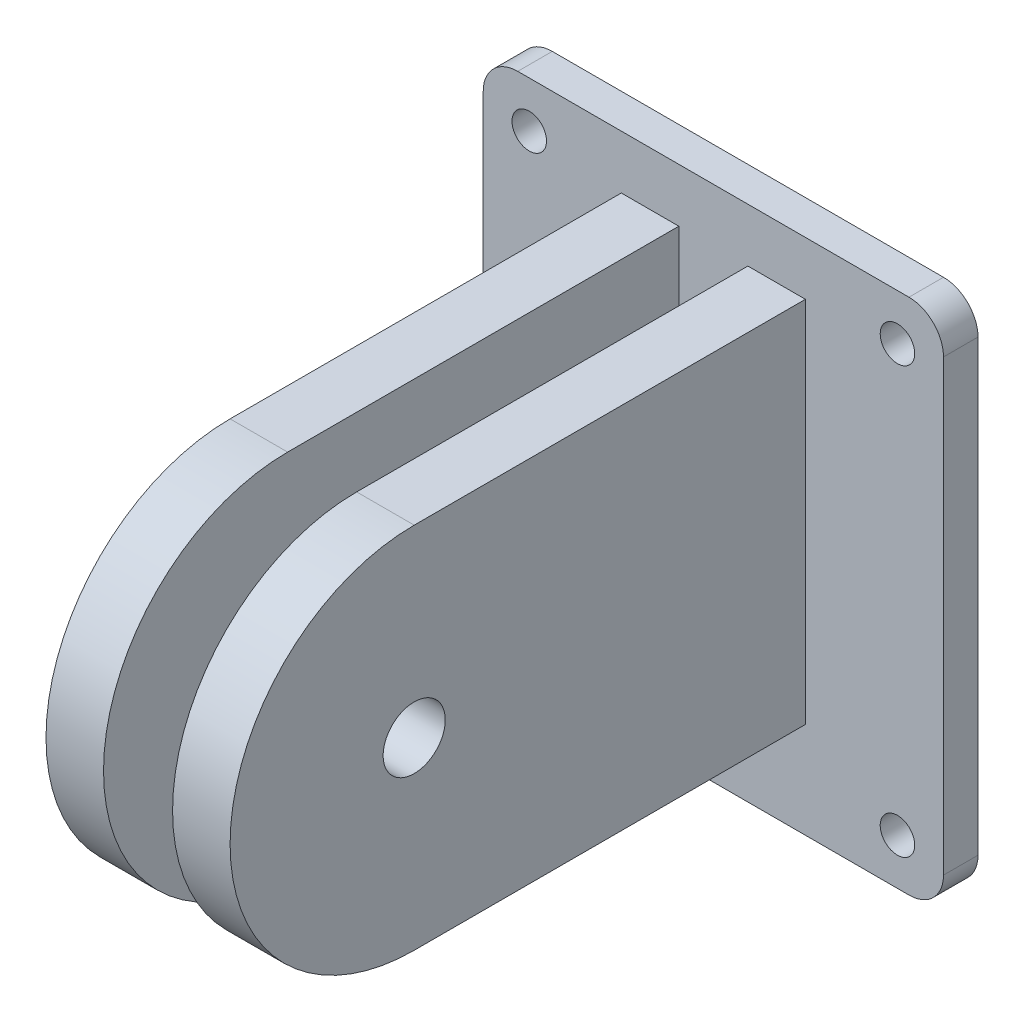
ISO-10303-21;
HEADER;
FILE_DESCRIPTION(('STEP AP214'),'2;1');
FILE_NAME('part.step','',(''),(''),'','','');
FILE_SCHEMA(('AUTOMOTIVE_DESIGN { 1 0 10303 214 1 1 1 1 }'));
ENDSEC;
DATA;
#1=APPLICATION_CONTEXT('core data for automotive mechanical design processes');
#2=APPLICATION_PROTOCOL_DEFINITION('international standard','automotive_design',2000,#1);
#3=PRODUCT_CONTEXT('',#1,'mechanical');
#4=PRODUCT('Part','Part','',(#3));
#5=PRODUCT_RELATED_PRODUCT_CATEGORY('part','',(#4));
#6=PRODUCT_DEFINITION_FORMATION('','',#4);
#7=PRODUCT_DEFINITION_CONTEXT('part definition',#1,'design');
#8=PRODUCT_DEFINITION('design','',#6,#7);
#9=PRODUCT_DEFINITION_SHAPE('','',#8);
#10=(LENGTH_UNIT() NAMED_UNIT(*) SI_UNIT(.MILLI.,.METRE.));
#11=(NAMED_UNIT(*) PLANE_ANGLE_UNIT() SI_UNIT($,.RADIAN.));
#12=(NAMED_UNIT(*) SI_UNIT($,.STERADIAN.) SOLID_ANGLE_UNIT());
#13=UNCERTAINTY_MEASURE_WITH_UNIT(LENGTH_MEASURE(1.E-05),#10,'distance_accuracy_value','');
#14=(GEOMETRIC_REPRESENTATION_CONTEXT(3) GLOBAL_UNCERTAINTY_ASSIGNED_CONTEXT((#13)) GLOBAL_UNIT_ASSIGNED_CONTEXT((#10,
#11,#12)) REPRESENTATION_CONTEXT('',''));
#15=CARTESIAN_POINT('',(0.,0.,0.));
#16=DIRECTION('',(0.,0.,1.));
#17=DIRECTION('',(1.,0.,0.));
#18=AXIS2_PLACEMENT_3D('',#15,#16,#17);
#19=CARTESIAN_POINT('',(2.99999999999999,442.,53.));
#20=DIRECTION('',(0.,-1.,0.));
#21=DIRECTION('',(0.,0.,-1.));
#22=AXIS2_PLACEMENT_3D('',#19,#20,#21);
#23=PLANE('',#22);
#24=DIRECTION('',(1.,0.,0.));
#25=VECTOR('',#24,1.);
#26=CARTESIAN_POINT('',(-20.,442.,37.));
#27=LINE('',#26,#25);
#28=CARTESIAN_POINT('',(2.99999999999998,442.,37.));
#29=VERTEX_POINT('',#28);
#30=CARTESIAN_POINT('',(7.99999999999999,442.,37.));
#31=VERTEX_POINT('',#30);
#32=EDGE_CURVE('E166',#29,#31,#27,.T.);
#33=ORIENTED_EDGE('',*,*,#32,.T.);
#34=DIRECTION('',(0.,0.,-1.));
#35=VECTOR('',#34,1.);
#36=CARTESIAN_POINT('',(7.99999999999999,442.,53.));
#37=LINE('',#36,#35);
#38=CARTESIAN_POINT('',(7.99999999999999,442.,3.));
#39=VERTEX_POINT('',#38);
#40=EDGE_CURVE('E165',#31,#39,#37,.T.);
#41=ORIENTED_EDGE('',*,*,#40,.T.);
#42=DIRECTION('',(-1.,0.,0.));
#43=VECTOR('',#42,1.);
#44=CARTESIAN_POINT('',(2.99999999999999,442.,3.));
#45=LINE('',#44,#43);
#46=CARTESIAN_POINT('',(2.99999999999999,442.,3.));
#47=VERTEX_POINT('',#46);
#48=EDGE_CURVE('E371',#39,#47,#45,.T.);
#49=ORIENTED_EDGE('',*,*,#48,.T.);
#50=DIRECTION('',(0.,0.,-1.));
#51=VECTOR('',#50,1.);
#52=CARTESIAN_POINT('',(2.99999999999999,442.,53.));
#53=LINE('',#52,#51);
#54=EDGE_CURVE('E177',#29,#47,#53,.T.);
#55=ORIENTED_EDGE('',*,*,#54,.F.);
#56=EDGE_LOOP('',(#33,#41,#49,#55));
#57=FACE_BOUND('',#56,.T.);
#58=ADVANCED_FACE('F32',(#57),#23,.F.);
#59=CARTESIAN_POINT('',(-3.00000000000001,442.,53.));
#60=DIRECTION('',(0.,-1.,0.));
#61=DIRECTION('',(0.,0.,-1.));
#62=AXIS2_PLACEMENT_3D('',#59,#60,#61);
#63=PLANE('',#62);
#64=CARTESIAN_POINT('',(-8.00000000000001,442.,37.));
#65=VERTEX_POINT('',#64);
#66=CARTESIAN_POINT('',(-3.00000000000002,442.,37.));
#67=VERTEX_POINT('',#66);
#68=EDGE_CURVE('E157',#65,#67,#27,.T.);
#69=ORIENTED_EDGE('',*,*,#68,.T.);
#70=DIRECTION('',(0.,0.,-1.));
#71=VECTOR('',#70,1.);
#72=CARTESIAN_POINT('',(-3.00000000000001,442.,53.));
#73=LINE('',#72,#71);
#74=CARTESIAN_POINT('',(-3.00000000000001,442.,3.));
#75=VERTEX_POINT('',#74);
#76=EDGE_CURVE('E363',#67,#75,#73,.T.);
#77=ORIENTED_EDGE('',*,*,#76,.T.);
#78=DIRECTION('',(-1.,0.,0.));
#79=VECTOR('',#78,1.);
#80=CARTESIAN_POINT('',(-3.00000000000001,442.,3.));
#81=LINE('',#80,#79);
#82=CARTESIAN_POINT('',(-8.,442.,3.));
#83=VERTEX_POINT('',#82);
#84=EDGE_CURVE('E348',#75,#83,#81,.T.);
#85=ORIENTED_EDGE('',*,*,#84,.T.);
#86=DIRECTION('',(0.,0.,-1.));
#87=VECTOR('',#86,1.);
#88=CARTESIAN_POINT('',(-8.,442.,53.));
#89=LINE('',#88,#87);
#90=EDGE_CURVE('E361',#65,#83,#89,.T.);
#91=ORIENTED_EDGE('',*,*,#90,.F.);
#92=EDGE_LOOP('',(#69,#77,#85,#91));
#93=FACE_BOUND('',#92,.T.);
#94=ADVANCED_FACE('F276',(#93),#63,.F.);
#95=CARTESIAN_POINT('',(0.,0.,3.));
#96=DIRECTION('',(0.,0.,-1.));
#97=DIRECTION('',(-1.,0.,0.));
#98=AXIS2_PLACEMENT_3D('',#95,#96,#97);
#99=PLANE('',#98);
#100=CARTESIAN_POINT('',(16.,442.657979856674,3.));
#101=DIRECTION('',(0.,0.,1.));
#102=DIRECTION('',(-1.,0.,0.));
#103=AXIS2_PLACEMENT_3D('',#100,#101,#102);
#104=CIRCLE('',#103,1.5);
#105=CARTESIAN_POINT('',(14.5,442.657979856674,3.));
#106=VERTEX_POINT('',#105);
#107=EDGE_CURVE('E541',#106,#106,#104,.T.);
#108=ORIENTED_EDGE('',*,*,#107,.F.);
#109=EDGE_LOOP('',(#108));
#110=FACE_BOUND('',#109,.T.);
#111=CARTESIAN_POINT('',(16.,405.657979856674,3.));
#112=DIRECTION('',(0.,0.,1.));
#113=DIRECTION('',(1.,0.,0.));
#114=AXIS2_PLACEMENT_3D('',#111,#112,#113);
#115=CIRCLE('',#114,1.5);
#116=CARTESIAN_POINT('',(17.5,405.657979856674,3.));
#117=VERTEX_POINT('',#116);
#118=EDGE_CURVE('E543',#117,#117,#115,.T.);
#119=ORIENTED_EDGE('',*,*,#118,.F.);
#120=EDGE_LOOP('',(#119));
#121=FACE_BOUND('',#120,.T.);
#122=CARTESIAN_POINT('',(-16.,405.657979856674,3.));
#123=DIRECTION('',(0.,0.,1.));
#124=DIRECTION('',(-1.,0.,0.));
#125=AXIS2_PLACEMENT_3D('',#122,#123,#124);
#126=CIRCLE('',#125,1.5);
#127=CARTESIAN_POINT('',(-17.5,405.657979856674,3.));
#128=VERTEX_POINT('',#127);
#129=EDGE_CURVE('E555',#128,#128,#126,.T.);
#130=ORIENTED_EDGE('',*,*,#129,.F.);
#131=EDGE_LOOP('',(#130));
#132=FACE_BOUND('',#131,.T.);
#133=CARTESIAN_POINT('',(-16.,442.657979856674,3.));
#134=DIRECTION('',(0.,0.,1.));
#135=DIRECTION('',(1.,0.,0.));
#136=AXIS2_PLACEMENT_3D('',#133,#134,#135);
#137=CIRCLE('',#136,1.5);
#138=CARTESIAN_POINT('',(-14.5,442.657979856674,3.));
#139=VERTEX_POINT('',#138);
#140=EDGE_CURVE('E549',#139,#139,#137,.T.);
#141=ORIENTED_EDGE('',*,*,#140,.F.);
#142=EDGE_LOOP('',(#141));
#143=FACE_BOUND('',#142,.T.);
#144=DIRECTION('',(0.,-1.,0.));
#145=VECTOR('',#144,1.);
#146=CARTESIAN_POINT('',(2.99999999999999,442.,3.));
#147=LINE('',#146,#145);
#148=CARTESIAN_POINT('',(3.,410.,3.));
#149=VERTEX_POINT('',#148);
#150=EDGE_CURVE('E365',#47,#149,#147,.T.);
#151=ORIENTED_EDGE('',*,*,#150,.F.);
#152=ORIENTED_EDGE('',*,*,#48,.F.);
#153=DIRECTION('',(0.,1.,0.));
#154=VECTOR('',#153,1.);
#155=CARTESIAN_POINT('',(7.99999999999999,442.,3.));
#156=LINE('',#155,#154);
#157=CARTESIAN_POINT('',(8.,410.,3.));
#158=VERTEX_POINT('',#157);
#159=EDGE_CURVE('E369',#158,#39,#156,.T.);
#160=ORIENTED_EDGE('',*,*,#159,.F.);
#161=DIRECTION('',(1.,0.,0.));
#162=VECTOR('',#161,1.);
#163=CARTESIAN_POINT('',(3.,410.,3.));
#164=LINE('',#163,#162);
#165=EDGE_CURVE('E172',#149,#158,#164,.T.);
#166=ORIENTED_EDGE('',*,*,#165,.F.);
#167=EDGE_LOOP('',(#151,#152,#160,#166));
#168=FACE_BOUND('',#167,.T.);
#169=DIRECTION('',(0.,-1.,0.));
#170=VECTOR('',#169,1.);
#171=CARTESIAN_POINT('',(-20.,401.657979856674,3.));
#172=LINE('',#171,#170);
#173=CARTESIAN_POINT('',(-20.,443.657979856674,3.));
#174=VERTEX_POINT('',#173);
#175=CARTESIAN_POINT('',(-20.,404.657979856674,3.));
#176=VERTEX_POINT('',#175);
#177=EDGE_CURVE('E181',#174,#176,#172,.T.);
#178=ORIENTED_EDGE('',*,*,#177,.T.);
#179=CARTESIAN_POINT('',(-17.,404.657979856674,3.));
#180=DIRECTION('',(0.,0.,-1.));
#181=DIRECTION('',(-1.,0.,0.));
#182=AXIS2_PLACEMENT_3D('',#179,#180,#181);
#183=CIRCLE('',#182,3.);
#184=CARTESIAN_POINT('',(-17.,401.657979856674,3.));
#185=VERTEX_POINT('',#184);
#186=EDGE_CURVE('E228',#176,#185,#183,.F.);
#187=ORIENTED_EDGE('',*,*,#186,.T.);
#188=DIRECTION('',(1.,0.,0.));
#189=VECTOR('',#188,1.);
#190=CARTESIAN_POINT('',(-20.,401.657979856674,3.));
#191=LINE('',#190,#189);
#192=CARTESIAN_POINT('',(17.,401.657979856674,3.));
#193=VERTEX_POINT('',#192);
#194=EDGE_CURVE('E184',#185,#193,#191,.T.);
#195=ORIENTED_EDGE('',*,*,#194,.T.);
#196=CARTESIAN_POINT('',(17.,404.657979856674,3.));
#197=DIRECTION('',(0.,0.,-1.));
#198=DIRECTION('',(-1.,0.,0.));
#199=AXIS2_PLACEMENT_3D('',#196,#197,#198);
#200=CIRCLE('',#199,3.);
#201=CARTESIAN_POINT('',(20.,404.657979856674,3.));
#202=VERTEX_POINT('',#201);
#203=EDGE_CURVE('E224',#193,#202,#200,.F.);
#204=ORIENTED_EDGE('',*,*,#203,.T.);
#205=DIRECTION('',(0.,1.,0.));
#206=VECTOR('',#205,1.);
#207=CARTESIAN_POINT('',(20.,401.657979856674,3.));
#208=LINE('',#207,#206);
#209=CARTESIAN_POINT('',(20.,443.657979856674,3.));
#210=VERTEX_POINT('',#209);
#211=EDGE_CURVE('E188',#202,#210,#208,.T.);
#212=ORIENTED_EDGE('',*,*,#211,.T.);
#213=CARTESIAN_POINT('',(17.,443.657979856674,3.));
#214=DIRECTION('',(0.,0.,-1.));
#215=DIRECTION('',(-1.,0.,0.));
#216=AXIS2_PLACEMENT_3D('',#213,#214,#215);
#217=CIRCLE('',#216,3.);
#218=CARTESIAN_POINT('',(17.,446.657979856674,3.));
#219=VERTEX_POINT('',#218);
#220=EDGE_CURVE('E54',#210,#219,#217,.F.);
#221=ORIENTED_EDGE('',*,*,#220,.T.);
#222=DIRECTION('',(-1.,0.,0.));
#223=VECTOR('',#222,1.);
#224=CARTESIAN_POINT('',(-20.,446.657979856674,3.));
#225=LINE('',#224,#223);
#226=CARTESIAN_POINT('',(-17.,446.657979856674,3.));
#227=VERTEX_POINT('',#226);
#228=EDGE_CURVE('E190',#219,#227,#225,.T.);
#229=ORIENTED_EDGE('',*,*,#228,.T.);
#230=CARTESIAN_POINT('',(-17.,443.657979856674,3.));
#231=DIRECTION('',(0.,0.,-1.));
#232=DIRECTION('',(-1.,0.,0.));
#233=AXIS2_PLACEMENT_3D('',#230,#231,#232);
#234=CIRCLE('',#233,3.);
#235=EDGE_CURVE('E226',#227,#174,#234,.F.);
#236=ORIENTED_EDGE('',*,*,#235,.T.);
#237=EDGE_LOOP('',(#178,#187,#195,#204,#212,#221,#229,#236));
#238=FACE_BOUND('',#237,.T.);
#239=DIRECTION('',(0.,1.,0.));
#240=VECTOR('',#239,1.);
#241=CARTESIAN_POINT('',(-3.00000000000001,442.,3.));
#242=LINE('',#241,#240);
#243=CARTESIAN_POINT('',(-3.,410.,3.));
#244=VERTEX_POINT('',#243);
#245=EDGE_CURVE('E341',#244,#75,#242,.T.);
#246=ORIENTED_EDGE('',*,*,#245,.F.);
#247=DIRECTION('',(1.,0.,0.));
#248=VECTOR('',#247,1.);
#249=CARTESIAN_POINT('',(-3.,410.,3.));
#250=LINE('',#249,#248);
#251=CARTESIAN_POINT('',(-8.,410.,3.));
#252=VERTEX_POINT('',#251);
#253=EDGE_CURVE('E354',#252,#244,#250,.T.);
#254=ORIENTED_EDGE('',*,*,#253,.F.);
#255=DIRECTION('',(0.,-1.,0.));
#256=VECTOR('',#255,1.);
#257=CARTESIAN_POINT('',(-8.,442.,3.));
#258=LINE('',#257,#256);
#259=EDGE_CURVE('E351',#83,#252,#258,.T.);
#260=ORIENTED_EDGE('',*,*,#259,.F.);
#261=ORIENTED_EDGE('',*,*,#84,.F.);
#262=EDGE_LOOP('',(#246,#254,#260,#261));
#263=FACE_BOUND('',#262,.T.);
#264=ADVANCED_FACE('F240',(#110,#121,#132,#143,#168,#238,#263),#99,.F.);
#265=CARTESIAN_POINT('',(-20.,401.657979856674,3.));
#266=DIRECTION('',(1.,0.,0.));
#267=DIRECTION('',(0.,0.,-1.));
#268=AXIS2_PLACEMENT_3D('',#265,#266,#267);
#269=PLANE('',#268);
#270=DIRECTION('',(0.,-1.,0.));
#271=VECTOR('',#270,1.);
#272=CARTESIAN_POINT('',(-20.,401.657979856674,0.));
#273=LINE('',#272,#271);
#274=CARTESIAN_POINT('',(-20.,443.657979856674,0.));
#275=VERTEX_POINT('',#274);
#276=CARTESIAN_POINT('',(-20.,404.657979856674,0.));
#277=VERTEX_POINT('',#276);
#278=EDGE_CURVE('E175',#275,#277,#273,.T.);
#279=ORIENTED_EDGE('',*,*,#278,.T.);
#280=DIRECTION('',(0.,0.,-1.));
#281=VECTOR('',#280,1.);
#282=CARTESIAN_POINT('',(-20.,404.657979856674,3.));
#283=LINE('',#282,#281);
#284=EDGE_CURVE('E221',#277,#176,#283,.F.);
#285=ORIENTED_EDGE('',*,*,#284,.T.);
#286=ORIENTED_EDGE('',*,*,#177,.F.);
#287=DIRECTION('',(0.,0.,-1.));
#288=VECTOR('',#287,1.);
#289=CARTESIAN_POINT('',(-20.,443.657979856674,3.));
#290=LINE('',#289,#288);
#291=EDGE_CURVE('E218',#174,#275,#290,.T.);
#292=ORIENTED_EDGE('',*,*,#291,.T.);
#293=EDGE_LOOP('',(#279,#285,#286,#292));
#294=FACE_BOUND('',#293,.T.);
#295=ADVANCED_FACE('F256',(#294),#269,.F.);
#296=CARTESIAN_POINT('',(-20.,401.657979856674,3.));
#297=DIRECTION('',(0.,1.,0.));
#298=DIRECTION('',(0.,0.,1.));
#299=AXIS2_PLACEMENT_3D('',#296,#297,#298);
#300=PLANE('',#299);
#301=ORIENTED_EDGE('',*,*,#194,.F.);
#302=DIRECTION('',(0.,0.,-1.));
#303=VECTOR('',#302,1.);
#304=CARTESIAN_POINT('',(-17.,401.657979856674,3.));
#305=LINE('',#304,#303);
#306=CARTESIAN_POINT('',(-17.,401.657979856674,0.));
#307=VERTEX_POINT('',#306);
#308=EDGE_CURVE('E207',#185,#307,#305,.T.);
#309=ORIENTED_EDGE('',*,*,#308,.T.);
#310=DIRECTION('',(1.,0.,0.));
#311=VECTOR('',#310,1.);
#312=CARTESIAN_POINT('',(-20.,401.657979856674,0.));
#313=LINE('',#312,#311);
#314=CARTESIAN_POINT('',(17.,401.657979856674,0.));
#315=VERTEX_POINT('',#314);
#316=EDGE_CURVE('E195',#307,#315,#313,.T.);
#317=ORIENTED_EDGE('',*,*,#316,.T.);
#318=DIRECTION('',(0.,0.,-1.));
#319=VECTOR('',#318,1.);
#320=CARTESIAN_POINT('',(17.,401.657979856674,3.));
#321=LINE('',#320,#319);
#322=EDGE_CURVE('E192',#315,#193,#321,.F.);
#323=ORIENTED_EDGE('',*,*,#322,.T.);
#324=EDGE_LOOP('',(#301,#309,#317,#323));
#325=FACE_BOUND('',#324,.T.);
#326=ADVANCED_FACE('F264',(#325),#300,.F.);
#327=CARTESIAN_POINT('',(20.,401.657979856674,3.));
#328=DIRECTION('',(-1.,0.,0.));
#329=DIRECTION('',(0.,0.,1.));
#330=AXIS2_PLACEMENT_3D('',#327,#328,#329);
#331=PLANE('',#330);
#332=ORIENTED_EDGE('',*,*,#211,.F.);
#333=DIRECTION('',(0.,0.,-1.));
#334=VECTOR('',#333,1.);
#335=CARTESIAN_POINT('',(20.,404.657979856674,3.));
#336=LINE('',#335,#334);
#337=CARTESIAN_POINT('',(20.,404.657979856674,0.));
#338=VERTEX_POINT('',#337);
#339=EDGE_CURVE('E11',#202,#338,#336,.T.);
#340=ORIENTED_EDGE('',*,*,#339,.T.);
#341=DIRECTION('',(0.,1.,0.));
#342=VECTOR('',#341,1.);
#343=CARTESIAN_POINT('',(20.,401.657979856674,0.));
#344=LINE('',#343,#342);
#345=CARTESIAN_POINT('',(20.,443.657979856674,0.));
#346=VERTEX_POINT('',#345);
#347=EDGE_CURVE('E198',#338,#346,#344,.T.);
#348=ORIENTED_EDGE('',*,*,#347,.T.);
#349=DIRECTION('',(0.,0.,-1.));
#350=VECTOR('',#349,1.);
#351=CARTESIAN_POINT('',(20.,443.657979856674,3.));
#352=LINE('',#351,#350);
#353=EDGE_CURVE('E40',#346,#210,#352,.F.);
#354=ORIENTED_EDGE('',*,*,#353,.T.);
#355=EDGE_LOOP('',(#332,#340,#348,#354));
#356=FACE_BOUND('',#355,.T.);
#357=ADVANCED_FACE('F236',(#356),#331,.F.);
#358=CARTESIAN_POINT('',(-20.,446.657979856674,3.));
#359=DIRECTION('',(0.,-1.,0.));
#360=DIRECTION('',(0.,0.,-1.));
#361=AXIS2_PLACEMENT_3D('',#358,#359,#360);
#362=PLANE('',#361);
#363=DIRECTION('',(-1.,0.,0.));
#364=VECTOR('',#363,1.);
#365=CARTESIAN_POINT('',(-20.,446.657979856674,0.));
#366=LINE('',#365,#364);
#367=CARTESIAN_POINT('',(17.,446.657979856674,0.));
#368=VERTEX_POINT('',#367);
#369=CARTESIAN_POINT('',(-17.,446.657979856674,0.));
#370=VERTEX_POINT('',#369);
#371=EDGE_CURVE('E185',#368,#370,#366,.T.);
#372=ORIENTED_EDGE('',*,*,#371,.T.);
#373=DIRECTION('',(0.,0.,-1.));
#374=VECTOR('',#373,1.);
#375=CARTESIAN_POINT('',(-17.,446.657979856674,3.));
#376=LINE('',#375,#374);
#377=EDGE_CURVE('E47',#370,#227,#376,.F.);
#378=ORIENTED_EDGE('',*,*,#377,.T.);
#379=ORIENTED_EDGE('',*,*,#228,.F.);
#380=DIRECTION('',(0.,0.,-1.));
#381=VECTOR('',#380,1.);
#382=CARTESIAN_POINT('',(17.,446.657979856674,3.));
#383=LINE('',#382,#381);
#384=EDGE_CURVE('E230',#219,#368,#383,.T.);
#385=ORIENTED_EDGE('',*,*,#384,.T.);
#386=EDGE_LOOP('',(#372,#378,#379,#385));
#387=FACE_BOUND('',#386,.T.);
#388=ADVANCED_FACE('F245',(#387),#362,.F.);
#389=CARTESIAN_POINT('',(0.,0.,0.));
#390=DIRECTION('',(0.,0.,-1.));
#391=DIRECTION('',(-1.,0.,0.));
#392=AXIS2_PLACEMENT_3D('',#389,#390,#391);
#393=PLANE('',#392);
#394=CARTESIAN_POINT('',(16.,442.657979856674,0.));
#395=DIRECTION('',(0.,0.,1.));
#396=DIRECTION('',(-1.,0.,0.));
#397=AXIS2_PLACEMENT_3D('',#394,#395,#396);
#398=CIRCLE('',#397,1.5);
#399=CARTESIAN_POINT('',(14.5,442.657979856674,0.));
#400=VERTEX_POINT('',#399);
#401=EDGE_CURVE('E538',#400,#400,#398,.T.);
#402=ORIENTED_EDGE('',*,*,#401,.T.);
#403=EDGE_LOOP('',(#402));
#404=FACE_BOUND('',#403,.T.);
#405=CARTESIAN_POINT('',(16.,405.657979856674,0.));
#406=DIRECTION('',(0.,0.,1.));
#407=DIRECTION('',(1.,0.,0.));
#408=AXIS2_PLACEMENT_3D('',#405,#406,#407);
#409=CIRCLE('',#408,1.5);
#410=CARTESIAN_POINT('',(17.5,405.657979856674,0.));
#411=VERTEX_POINT('',#410);
#412=EDGE_CURVE('E560',#411,#411,#409,.T.);
#413=ORIENTED_EDGE('',*,*,#412,.T.);
#414=EDGE_LOOP('',(#413));
#415=FACE_BOUND('',#414,.T.);
#416=CARTESIAN_POINT('',(-16.,405.657979856674,0.));
#417=DIRECTION('',(0.,0.,1.));
#418=DIRECTION('',(-1.,0.,0.));
#419=AXIS2_PLACEMENT_3D('',#416,#417,#418);
#420=CIRCLE('',#419,1.5);
#421=CARTESIAN_POINT('',(-17.5,405.657979856674,0.));
#422=VERTEX_POINT('',#421);
#423=EDGE_CURVE('E551',#422,#422,#420,.T.);
#424=ORIENTED_EDGE('',*,*,#423,.T.);
#425=EDGE_LOOP('',(#424));
#426=FACE_BOUND('',#425,.T.);
#427=CARTESIAN_POINT('',(-16.,442.657979856674,0.));
#428=DIRECTION('',(0.,0.,1.));
#429=DIRECTION('',(1.,0.,0.));
#430=AXIS2_PLACEMENT_3D('',#427,#428,#429);
#431=CIRCLE('',#430,1.5);
#432=CARTESIAN_POINT('',(-14.5,442.657979856674,0.));
#433=VERTEX_POINT('',#432);
#434=EDGE_CURVE('E167',#433,#433,#431,.T.);
#435=ORIENTED_EDGE('',*,*,#434,.T.);
#436=EDGE_LOOP('',(#435));
#437=FACE_BOUND('',#436,.T.);
#438=ORIENTED_EDGE('',*,*,#316,.F.);
#439=CARTESIAN_POINT('',(-17.,404.657979856674,0.));
#440=DIRECTION('',(0.,0.,-1.));
#441=DIRECTION('',(-1.,0.,0.));
#442=AXIS2_PLACEMENT_3D('',#439,#440,#441);
#443=CIRCLE('',#442,3.);
#444=EDGE_CURVE('E216',#307,#277,#443,.T.);
#445=ORIENTED_EDGE('',*,*,#444,.T.);
#446=ORIENTED_EDGE('',*,*,#278,.F.);
#447=CARTESIAN_POINT('',(-17.,443.657979856674,0.));
#448=DIRECTION('',(0.,0.,-1.));
#449=DIRECTION('',(-1.,0.,0.));
#450=AXIS2_PLACEMENT_3D('',#447,#448,#449);
#451=CIRCLE('',#450,3.);
#452=EDGE_CURVE('E214',#275,#370,#451,.T.);
#453=ORIENTED_EDGE('',*,*,#452,.T.);
#454=ORIENTED_EDGE('',*,*,#371,.F.);
#455=CARTESIAN_POINT('',(17.,443.657979856674,0.));
#456=DIRECTION('',(0.,0.,-1.));
#457=DIRECTION('',(-1.,0.,0.));
#458=AXIS2_PLACEMENT_3D('',#455,#456,#457);
#459=CIRCLE('',#458,3.);
#460=EDGE_CURVE('E210',#368,#346,#459,.T.);
#461=ORIENTED_EDGE('',*,*,#460,.T.);
#462=ORIENTED_EDGE('',*,*,#347,.F.);
#463=CARTESIAN_POINT('',(17.,404.657979856674,0.));
#464=DIRECTION('',(0.,0.,-1.));
#465=DIRECTION('',(-1.,0.,0.));
#466=AXIS2_PLACEMENT_3D('',#463,#464,#465);
#467=CIRCLE('',#466,3.);
#468=EDGE_CURVE('E212',#338,#315,#467,.T.);
#469=ORIENTED_EDGE('',*,*,#468,.T.);
#470=EDGE_LOOP('',(#438,#445,#446,#453,#454,#461,#462,#469));
#471=FACE_BOUND('',#470,.T.);
#472=ADVANCED_FACE('F248',(#404,#415,#426,#437,#471),#393,.T.);
#473=CARTESIAN_POINT('',(2.99999999999999,442.,53.));
#474=DIRECTION('',(1.,0.,0.));
#475=DIRECTION('',(0.,1.,0.));
#476=AXIS2_PLACEMENT_3D('',#473,#474,#475);
#477=PLANE('',#476);
#478=CARTESIAN_POINT('',(3.,426.,37.));
#479=DIRECTION('',(1.,0.,0.));
#480=DIRECTION('',(0.,1.,0.));
#481=AXIS2_PLACEMENT_3D('',#478,#479,#480);
#482=CIRCLE('',#481,2.70000000000007);
#483=CARTESIAN_POINT('',(2.99999999999999,428.7,37.));
#484=VERTEX_POINT('',#483);
#485=EDGE_CURVE('E338',#484,#484,#482,.T.);
#486=ORIENTED_EDGE('',*,*,#485,.T.);
#487=EDGE_LOOP('',(#486));
#488=FACE_BOUND('',#487,.T.);
#489=DIRECTION('',(0.,0.,-1.));
#490=VECTOR('',#489,1.);
#491=CARTESIAN_POINT('',(3.,410.,53.));
#492=LINE('',#491,#490);
#493=CARTESIAN_POINT('',(2.99999999999998,410.,37.));
#494=VERTEX_POINT('',#493);
#495=EDGE_CURVE('E173',#494,#149,#492,.T.);
#496=ORIENTED_EDGE('',*,*,#495,.F.);
#497=CARTESIAN_POINT('',(3.,426.,37.));
#498=DIRECTION('',(1.,0.,0.));
#499=DIRECTION('',(0.,1.,0.));
#500=AXIS2_PLACEMENT_3D('',#497,#498,#499);
#501=CIRCLE('',#500,16.);
#502=EDGE_CURVE('E152',#494,#29,#501,.F.);
#503=ORIENTED_EDGE('',*,*,#502,.T.);
#504=ORIENTED_EDGE('',*,*,#54,.T.);
#505=ORIENTED_EDGE('',*,*,#150,.T.);
#506=EDGE_LOOP('',(#496,#503,#504,#505));
#507=FACE_BOUND('',#506,.T.);
#508=ADVANCED_FACE('F292',(#488,#507),#477,.F.);
#509=CARTESIAN_POINT('',(3.,410.,53.));
#510=DIRECTION('',(0.,1.,0.));
#511=DIRECTION('',(0.,0.,1.));
#512=AXIS2_PLACEMENT_3D('',#509,#510,#511);
#513=PLANE('',#512);
#514=DIRECTION('',(0.,0.,-1.));
#515=VECTOR('',#514,1.);
#516=CARTESIAN_POINT('',(8.,410.,53.));
#517=LINE('',#516,#515);
#518=CARTESIAN_POINT('',(7.99999999999999,410.,37.));
#519=VERTEX_POINT('',#518);
#520=EDGE_CURVE('E163',#519,#158,#517,.T.);
#521=ORIENTED_EDGE('',*,*,#520,.F.);
#522=DIRECTION('',(1.,0.,0.));
#523=VECTOR('',#522,1.);
#524=CARTESIAN_POINT('',(-20.,410.,37.));
#525=LINE('',#524,#523);
#526=EDGE_CURVE('E146',#494,#519,#525,.T.);
#527=ORIENTED_EDGE('',*,*,#526,.F.);
#528=ORIENTED_EDGE('',*,*,#495,.T.);
#529=ORIENTED_EDGE('',*,*,#165,.T.);
#530=EDGE_LOOP('',(#521,#527,#528,#529));
#531=FACE_BOUND('',#530,.T.);
#532=ADVANCED_FACE('F170',(#531),#513,.F.);
#533=CARTESIAN_POINT('',(7.99999999999999,442.,53.));
#534=DIRECTION('',(-1.,0.,0.));
#535=DIRECTION('',(0.,-1.,0.));
#536=AXIS2_PLACEMENT_3D('',#533,#534,#535);
#537=PLANE('',#536);
#538=CARTESIAN_POINT('',(7.99999999999999,426.,37.));
#539=DIRECTION('',(1.,0.,0.));
#540=DIRECTION('',(0.,1.,0.));
#541=AXIS2_PLACEMENT_3D('',#538,#539,#540);
#542=CIRCLE('',#541,2.70000000000007);
#543=CARTESIAN_POINT('',(7.99999999999999,428.7,37.));
#544=VERTEX_POINT('',#543);
#545=EDGE_CURVE('E381',#544,#544,#542,.T.);
#546=ORIENTED_EDGE('',*,*,#545,.F.);
#547=EDGE_LOOP('',(#546));
#548=FACE_BOUND('',#547,.T.);
#549=ORIENTED_EDGE('',*,*,#40,.F.);
#550=CARTESIAN_POINT('',(7.99999999999999,426.,37.));
#551=DIRECTION('',(-1.,0.,0.));
#552=DIRECTION('',(0.,1.,0.));
#553=AXIS2_PLACEMENT_3D('',#550,#551,#552);
#554=CIRCLE('',#553,16.);
#555=EDGE_CURVE('E150',#519,#31,#554,.T.);
#556=ORIENTED_EDGE('',*,*,#555,.F.);
#557=ORIENTED_EDGE('',*,*,#520,.T.);
#558=ORIENTED_EDGE('',*,*,#159,.T.);
#559=EDGE_LOOP('',(#549,#556,#557,#558));
#560=FACE_BOUND('',#559,.T.);
#561=ADVANCED_FACE('F161',(#548,#560),#537,.F.);
#562=CARTESIAN_POINT('',(-3.00000000000001,442.,53.));
#563=DIRECTION('',(-1.,0.,0.));
#564=DIRECTION('',(0.,-1.,0.));
#565=AXIS2_PLACEMENT_3D('',#562,#563,#564);
#566=PLANE('',#565);
#567=CARTESIAN_POINT('',(-3.,426.,37.));
#568=DIRECTION('',(-1.,0.,0.));
#569=DIRECTION('',(0.,-1.,0.));
#570=AXIS2_PLACEMENT_3D('',#567,#568,#569);
#571=CIRCLE('',#570,2.70000000000007);
#572=CARTESIAN_POINT('',(-3.00000000000001,428.7,37.));
#573=VERTEX_POINT('',#572);
#574=EDGE_CURVE('E205',#573,#573,#571,.T.);
#575=ORIENTED_EDGE('',*,*,#574,.T.);
#576=EDGE_LOOP('',(#575));
#577=FACE_BOUND('',#576,.T.);
#578=ORIENTED_EDGE('',*,*,#76,.F.);
#579=CARTESIAN_POINT('',(-3.,426.,37.));
#580=DIRECTION('',(-1.,0.,0.));
#581=DIRECTION('',(0.,-1.,0.));
#582=AXIS2_PLACEMENT_3D('',#579,#580,#581);
#583=CIRCLE('',#582,16.);
#584=CARTESIAN_POINT('',(-3.00000000000001,410.,37.));
#585=VERTEX_POINT('',#584);
#586=EDGE_CURVE('E385',#67,#585,#583,.F.);
#587=ORIENTED_EDGE('',*,*,#586,.T.);
#588=DIRECTION('',(0.,0.,-1.));
#589=VECTOR('',#588,1.);
#590=CARTESIAN_POINT('',(-3.,410.,53.));
#591=LINE('',#590,#589);
#592=EDGE_CURVE('E357',#585,#244,#591,.T.);
#593=ORIENTED_EDGE('',*,*,#592,.T.);
#594=ORIENTED_EDGE('',*,*,#245,.T.);
#595=EDGE_LOOP('',(#578,#587,#593,#594));
#596=FACE_BOUND('',#595,.T.);
#597=ADVANCED_FACE('F286',(#577,#596),#566,.F.);
#598=CARTESIAN_POINT('',(-8.,442.,53.));
#599=DIRECTION('',(1.,0.,0.));
#600=DIRECTION('',(0.,1.,0.));
#601=AXIS2_PLACEMENT_3D('',#598,#599,#600);
#602=PLANE('',#601);
#603=CARTESIAN_POINT('',(-8.,426.,37.));
#604=DIRECTION('',(1.,0.,0.));
#605=DIRECTION('',(0.,1.,0.));
#606=AXIS2_PLACEMENT_3D('',#603,#604,#605);
#607=CIRCLE('',#606,2.70000000000007);
#608=CARTESIAN_POINT('',(-8.00000000000001,428.7,37.));
#609=VERTEX_POINT('',#608);
#610=EDGE_CURVE('E202',#609,#609,#607,.T.);
#611=ORIENTED_EDGE('',*,*,#610,.T.);
#612=EDGE_LOOP('',(#611));
#613=FACE_BOUND('',#612,.T.);
#614=DIRECTION('',(0.,0.,-1.));
#615=VECTOR('',#614,1.);
#616=CARTESIAN_POINT('',(-8.,410.,53.));
#617=LINE('',#616,#615);
#618=CARTESIAN_POINT('',(-8.,410.,37.));
#619=VERTEX_POINT('',#618);
#620=EDGE_CURVE('E359',#619,#252,#617,.T.);
#621=ORIENTED_EDGE('',*,*,#620,.F.);
#622=CARTESIAN_POINT('',(-8.,426.,37.));
#623=DIRECTION('',(1.,0.,0.));
#624=DIRECTION('',(0.,1.,0.));
#625=AXIS2_PLACEMENT_3D('',#622,#623,#624);
#626=CIRCLE('',#625,16.);
#627=EDGE_CURVE('E383',#619,#65,#626,.F.);
#628=ORIENTED_EDGE('',*,*,#627,.T.);
#629=ORIENTED_EDGE('',*,*,#90,.T.);
#630=ORIENTED_EDGE('',*,*,#259,.T.);
#631=EDGE_LOOP('',(#621,#628,#629,#630));
#632=FACE_BOUND('',#631,.T.);
#633=ADVANCED_FACE('F398',(#613,#632),#602,.F.);
#634=CARTESIAN_POINT('',(-3.,410.,53.));
#635=DIRECTION('',(0.,1.,0.));
#636=DIRECTION('',(0.,0.,1.));
#637=AXIS2_PLACEMENT_3D('',#634,#635,#636);
#638=PLANE('',#637);
#639=ORIENTED_EDGE('',*,*,#592,.F.);
#640=EDGE_CURVE('E156',#619,#585,#525,.T.);
#641=ORIENTED_EDGE('',*,*,#640,.F.);
#642=ORIENTED_EDGE('',*,*,#620,.T.);
#643=ORIENTED_EDGE('',*,*,#253,.T.);
#644=EDGE_LOOP('',(#639,#641,#642,#643));
#645=FACE_BOUND('',#644,.T.);
#646=ADVANCED_FACE('F331',(#645),#638,.F.);
#647=CARTESIAN_POINT('',(-20.,426.,37.));
#648=DIRECTION('',(1.,0.,0.));
#649=DIRECTION('',(0.,1.,0.));
#650=AXIS2_PLACEMENT_3D('',#647,#648,#649);
#651=CYLINDRICAL_SURFACE('',#650,16.);
#652=ORIENTED_EDGE('',*,*,#68,.F.);
#653=ORIENTED_EDGE('',*,*,#627,.F.);
#654=ORIENTED_EDGE('',*,*,#640,.T.);
#655=ORIENTED_EDGE('',*,*,#586,.F.);
#656=EDGE_LOOP('',(#652,#653,#654,#655));
#657=FACE_BOUND('',#656,.T.);
#658=ADVANCED_FACE('F322',(#657),#651,.T.);
#659=CARTESIAN_POINT('',(-20.,426.,37.));
#660=DIRECTION('',(1.,0.,0.));
#661=DIRECTION('',(0.,1.,0.));
#662=AXIS2_PLACEMENT_3D('',#659,#660,#661);
#663=CYLINDRICAL_SURFACE('',#662,2.70000000000007);
#664=CARTESIAN_POINT('',(-8.00000000000001,428.7,37.));
#665=CARTESIAN_POINT('',(-7.94791666666667,428.7,37.));
#666=CARTESIAN_POINT('',(-7.89583333333334,428.7,37.));
#667=CARTESIAN_POINT('',(-7.79166666666667,428.7,37.));
#668=CARTESIAN_POINT('',(-7.73958333333334,428.7,37.));
#669=CARTESIAN_POINT('',(-7.63541666666667,428.7,37.));
#670=CARTESIAN_POINT('',(-7.58333333333334,428.7,37.));
#671=CARTESIAN_POINT('',(-7.47916666666667,428.7,37.));
#672=CARTESIAN_POINT('',(-7.42708333333334,428.7,37.));
#673=CARTESIAN_POINT('',(-7.32291666666667,428.7,37.));
#674=CARTESIAN_POINT('',(-7.27083333333334,428.7,37.));
#675=CARTESIAN_POINT('',(-7.16666666666667,428.7,37.));
#676=CARTESIAN_POINT('',(-7.11458333333334,428.7,37.));
#677=CARTESIAN_POINT('',(-7.01041666666667,428.7,37.));
#678=CARTESIAN_POINT('',(-6.95833333333334,428.7,37.));
#679=CARTESIAN_POINT('',(-6.85416666666667,428.7,37.));
#680=CARTESIAN_POINT('',(-6.80208333333334,428.7,37.));
#681=CARTESIAN_POINT('',(-6.69791666666667,428.7,37.));
#682=CARTESIAN_POINT('',(-6.64583333333334,428.7,37.));
#683=CARTESIAN_POINT('',(-6.54166666666667,428.7,37.));
#684=CARTESIAN_POINT('',(-6.48958333333334,428.7,37.));
#685=CARTESIAN_POINT('',(-6.38541666666667,428.7,37.));
#686=CARTESIAN_POINT('',(-6.33333333333334,428.7,37.));
#687=CARTESIAN_POINT('',(-6.22916666666667,428.7,37.));
#688=CARTESIAN_POINT('',(-6.17708333333334,428.7,37.));
#689=CARTESIAN_POINT('',(-6.07291666666667,428.7,37.));
#690=CARTESIAN_POINT('',(-6.02083333333334,428.7,37.));
#691=CARTESIAN_POINT('',(-5.91666666666667,428.7,37.));
#692=CARTESIAN_POINT('',(-5.86458333333334,428.7,37.));
#693=CARTESIAN_POINT('',(-5.76041666666667,428.7,37.));
#694=CARTESIAN_POINT('',(-5.70833333333334,428.7,37.));
#695=CARTESIAN_POINT('',(-5.60416666666667,428.7,37.));
#696=CARTESIAN_POINT('',(-5.55208333333334,428.7,37.));
#697=CARTESIAN_POINT('',(-5.44791666666667,428.7,37.));
#698=CARTESIAN_POINT('',(-5.39583333333334,428.7,37.));
#699=CARTESIAN_POINT('',(-5.29166666666667,428.7,37.));
#700=CARTESIAN_POINT('',(-5.23958333333334,428.7,37.));
#701=CARTESIAN_POINT('',(-5.13541666666667,428.7,37.));
#702=CARTESIAN_POINT('',(-5.08333333333334,428.7,37.));
#703=CARTESIAN_POINT('',(-4.97916666666667,428.7,37.));
#704=CARTESIAN_POINT('',(-4.92708333333334,428.7,37.));
#705=CARTESIAN_POINT('',(-4.82291666666667,428.7,37.));
#706=CARTESIAN_POINT('',(-4.77083333333334,428.7,37.));
#707=CARTESIAN_POINT('',(-4.66666666666667,428.7,37.));
#708=CARTESIAN_POINT('',(-4.61458333333334,428.7,37.));
#709=CARTESIAN_POINT('',(-4.51041666666667,428.7,37.));
#710=CARTESIAN_POINT('',(-4.45833333333334,428.7,37.));
#711=CARTESIAN_POINT('',(-4.35416666666667,428.7,37.));
#712=CARTESIAN_POINT('',(-4.30208333333334,428.7,37.));
#713=CARTESIAN_POINT('',(-4.19791666666667,428.7,37.));
#714=CARTESIAN_POINT('',(-4.14583333333334,428.7,37.));
#715=CARTESIAN_POINT('',(-4.04166666666667,428.7,37.));
#716=CARTESIAN_POINT('',(-3.98958333333334,428.7,37.));
#717=CARTESIAN_POINT('',(-3.88541666666667,428.7,37.));
#718=CARTESIAN_POINT('',(-3.83333333333334,428.7,37.));
#719=CARTESIAN_POINT('',(-3.72916666666667,428.7,37.));
#720=CARTESIAN_POINT('',(-3.67708333333334,428.7,37.));
#721=CARTESIAN_POINT('',(-3.57291666666667,428.7,37.));
#722=CARTESIAN_POINT('',(-3.52083333333334,428.7,37.));
#723=CARTESIAN_POINT('',(-3.41666666666667,428.7,37.));
#724=CARTESIAN_POINT('',(-3.36458333333334,428.7,37.));
#725=CARTESIAN_POINT('',(-3.26041666666667,428.7,37.));
#726=CARTESIAN_POINT('',(-3.20833333333334,428.7,37.));
#727=CARTESIAN_POINT('',(-3.10416666666667,428.7,37.));
#728=CARTESIAN_POINT('',(-3.05208333333334,428.7,37.));
#729=CARTESIAN_POINT('',(-3.00000000000001,428.7,37.));
#730=B_SPLINE_CURVE_WITH_KNOTS('',3,(#664,#665,#666,#667,#668,#669,#670,#671,#672,#673,#674,
#675,#676,#677,#678,#679,#680,#681,#682,#683,#684,#685,#686,#687,#688,#689,#690,#691,#692,#693,
#694,#695,#696,#697,#698,#699,#700,#701,#702,#703,#704,#705,#706,#707,#708,#709,#710,#711,#712,
#713,#714,#715,#716,#717,#718,#719,#720,#721,#722,#723,#724,#725,#726,#727,#728,#729),
.UNSPECIFIED.,.F.,.F.,(4,2,2,2,2,2,2,2,2,2,2,2,2,2,2,2,2,2,2,2,2,2,2,2,2,2,2,2,2,2,2,2,4),(0.,
0.15625,0.3125,0.46875,0.625000000000001,0.781250000000001,0.937500000000001,1.09375,1.25,
1.40625,1.5625,1.71875,1.875,2.03125,2.1875,2.34375,2.5,2.65625,2.8125,2.96875,3.125,3.28125,
3.4375,3.59375,3.75,3.90625,4.0625,4.21875,4.375,4.53125,4.6875,4.84375,5.),.UNSPECIFIED.);
#731=EDGE_CURVE('BSEAM317',#609,#573,#730,.T.);
#732=ORIENTED_EDGE('',*,*,#610,.F.);
#733=ORIENTED_EDGE('',*,*,#574,.F.);
#734=ORIENTED_EDGE('',*,*,#731,.T.);
#735=ORIENTED_EDGE('',*,*,#731,.F.);
#736=EDGE_LOOP('',(#732,#734,#733,#735));
#737=FACE_BOUND('',#736,.T.);
#738=ADVANCED_FACE('F317',(#737),#663,.F.);
#739=ORIENTED_EDGE('',*,*,#526,.T.);
#740=ORIENTED_EDGE('',*,*,#555,.T.);
#741=ORIENTED_EDGE('',*,*,#32,.F.);
#742=ORIENTED_EDGE('',*,*,#502,.F.);
#743=EDGE_LOOP('',(#739,#740,#741,#742));
#744=FACE_BOUND('',#743,.T.);
#745=ADVANCED_FACE('F148',(#744),#651,.T.);
#746=CARTESIAN_POINT('',(7.99999999999999,428.7,37.));
#747=CARTESIAN_POINT('',(7.94791666666666,428.7,37.));
#748=CARTESIAN_POINT('',(7.89583333333332,428.7,37.));
#749=CARTESIAN_POINT('',(7.79166666666666,428.7,37.));
#750=CARTESIAN_POINT('',(7.73958333333332,428.7,37.));
#751=CARTESIAN_POINT('',(7.63541666666666,428.7,37.));
#752=CARTESIAN_POINT('',(7.58333333333332,428.7,37.));
#753=CARTESIAN_POINT('',(7.47916666666666,428.7,37.));
#754=CARTESIAN_POINT('',(7.42708333333332,428.7,37.));
#755=CARTESIAN_POINT('',(7.32291666666666,428.7,37.));
#756=CARTESIAN_POINT('',(7.27083333333332,428.7,37.));
#757=CARTESIAN_POINT('',(7.16666666666666,428.7,37.));
#758=CARTESIAN_POINT('',(7.11458333333332,428.7,37.));
#759=CARTESIAN_POINT('',(7.01041666666666,428.7,37.));
#760=CARTESIAN_POINT('',(6.95833333333332,428.7,37.));
#761=CARTESIAN_POINT('',(6.85416666666666,428.7,37.));
#762=CARTESIAN_POINT('',(6.80208333333332,428.7,37.));
#763=CARTESIAN_POINT('',(6.69791666666666,428.7,37.));
#764=CARTESIAN_POINT('',(6.64583333333332,428.7,37.));
#765=CARTESIAN_POINT('',(6.54166666666666,428.7,37.));
#766=CARTESIAN_POINT('',(6.48958333333333,428.7,37.));
#767=CARTESIAN_POINT('',(6.38541666666666,428.7,37.));
#768=CARTESIAN_POINT('',(6.33333333333333,428.7,37.));
#769=CARTESIAN_POINT('',(6.22916666666666,428.7,37.));
#770=CARTESIAN_POINT('',(6.17708333333333,428.7,37.));
#771=CARTESIAN_POINT('',(6.07291666666666,428.7,37.));
#772=CARTESIAN_POINT('',(6.02083333333333,428.7,37.));
#773=CARTESIAN_POINT('',(5.91666666666666,428.7,37.));
#774=CARTESIAN_POINT('',(5.86458333333333,428.7,37.));
#775=CARTESIAN_POINT('',(5.76041666666666,428.7,37.));
#776=CARTESIAN_POINT('',(5.70833333333333,428.7,37.));
#777=CARTESIAN_POINT('',(5.60416666666666,428.7,37.));
#778=CARTESIAN_POINT('',(5.55208333333333,428.7,37.));
#779=CARTESIAN_POINT('',(5.44791666666666,428.7,37.));
#780=CARTESIAN_POINT('',(5.39583333333332,428.7,37.));
#781=CARTESIAN_POINT('',(5.29166666666666,428.7,37.));
#782=CARTESIAN_POINT('',(5.23958333333332,428.7,37.));
#783=CARTESIAN_POINT('',(5.13541666666666,428.7,37.));
#784=CARTESIAN_POINT('',(5.08333333333332,428.7,37.));
#785=CARTESIAN_POINT('',(4.97916666666666,428.7,37.));
#786=CARTESIAN_POINT('',(4.92708333333332,428.7,37.));
#787=CARTESIAN_POINT('',(4.82291666666666,428.7,37.));
#788=CARTESIAN_POINT('',(4.77083333333332,428.7,37.));
#789=CARTESIAN_POINT('',(4.66666666666666,428.7,37.));
#790=CARTESIAN_POINT('',(4.61458333333332,428.7,37.));
#791=CARTESIAN_POINT('',(4.51041666666666,428.7,37.));
#792=CARTESIAN_POINT('',(4.45833333333332,428.7,37.));
#793=CARTESIAN_POINT('',(4.35416666666666,428.7,37.));
#794=CARTESIAN_POINT('',(4.30208333333333,428.7,37.));
#795=CARTESIAN_POINT('',(4.19791666666666,428.7,37.));
#796=CARTESIAN_POINT('',(4.14583333333332,428.7,37.));
#797=CARTESIAN_POINT('',(4.04166666666666,428.7,37.));
#798=CARTESIAN_POINT('',(3.98958333333333,428.7,37.));
#799=CARTESIAN_POINT('',(3.88541666666666,428.7,37.));
#800=CARTESIAN_POINT('',(3.83333333333333,428.7,37.));
#801=CARTESIAN_POINT('',(3.72916666666666,428.7,37.));
#802=CARTESIAN_POINT('',(3.67708333333333,428.7,37.));
#803=CARTESIAN_POINT('',(3.57291666666666,428.7,37.));
#804=CARTESIAN_POINT('',(3.52083333333333,428.7,37.));
#805=CARTESIAN_POINT('',(3.41666666666666,428.7,37.));
#806=CARTESIAN_POINT('',(3.36458333333333,428.7,37.));
#807=CARTESIAN_POINT('',(3.26041666666666,428.7,37.));
#808=CARTESIAN_POINT('',(3.20833333333333,428.7,37.));
#809=CARTESIAN_POINT('',(3.10416666666666,428.7,37.));
#810=CARTESIAN_POINT('',(3.05208333333333,428.7,37.));
#811=CARTESIAN_POINT('',(2.99999999999999,428.7,37.));
#812=B_SPLINE_CURVE_WITH_KNOTS('',3,(#746,#747,#748,#749,#750,#751,#752,#753,#754,#755,#756,
#757,#758,#759,#760,#761,#762,#763,#764,#765,#766,#767,#768,#769,#770,#771,#772,#773,#774,#775,
#776,#777,#778,#779,#780,#781,#782,#783,#784,#785,#786,#787,#788,#789,#790,#791,#792,#793,#794,
#795,#796,#797,#798,#799,#800,#801,#802,#803,#804,#805,#806,#807,#808,#809,#810,#811),
.UNSPECIFIED.,.F.,.F.,(4,2,2,2,2,2,2,2,2,2,2,2,2,2,2,2,2,2,2,2,2,2,2,2,2,2,2,2,2,2,2,2,4),(0.,
0.15625,0.3125,0.46875,0.625000000000001,0.781250000000001,0.937500000000001,1.09375,1.25,
1.40625,1.5625,1.71875,1.875,2.03125,2.1875,2.34375,2.5,2.65625,2.8125,2.96875,3.125,3.28125,
3.4375,3.59375,3.75,3.90625,4.0625,4.21875,4.375,4.53125,4.6875,4.84375,5.),.UNSPECIFIED.);
#813=EDGE_CURVE('BSEAM311',#544,#484,#812,.T.);
#814=ORIENTED_EDGE('',*,*,#545,.T.);
#815=ORIENTED_EDGE('',*,*,#485,.F.);
#816=ORIENTED_EDGE('',*,*,#813,.T.);
#817=ORIENTED_EDGE('',*,*,#813,.F.);
#818=EDGE_LOOP('',(#814,#816,#815,#817));
#819=FACE_BOUND('',#818,.T.);
#820=ADVANCED_FACE('F311',(#819),#663,.F.);
#821=CARTESIAN_POINT('',(-17.,404.657979856674,3.));
#822=DIRECTION('',(0.,0.,-1.));
#823=DIRECTION('',(-1.,0.,0.));
#824=AXIS2_PLACEMENT_3D('',#821,#822,#823);
#825=CYLINDRICAL_SURFACE('',#824,3.);
#826=ORIENTED_EDGE('',*,*,#186,.F.);
#827=ORIENTED_EDGE('',*,*,#284,.F.);
#828=ORIENTED_EDGE('',*,*,#444,.F.);
#829=ORIENTED_EDGE('',*,*,#308,.F.);
#830=EDGE_LOOP('',(#826,#827,#828,#829));
#831=FACE_BOUND('',#830,.T.);
#832=ADVANCED_FACE('F262',(#831),#825,.T.);
#833=CARTESIAN_POINT('',(-17.,443.657979856674,3.));
#834=DIRECTION('',(0.,0.,-1.));
#835=DIRECTION('',(-1.,0.,0.));
#836=AXIS2_PLACEMENT_3D('',#833,#834,#835);
#837=CYLINDRICAL_SURFACE('',#836,3.);
#838=ORIENTED_EDGE('',*,*,#235,.F.);
#839=ORIENTED_EDGE('',*,*,#377,.F.);
#840=ORIENTED_EDGE('',*,*,#452,.F.);
#841=ORIENTED_EDGE('',*,*,#291,.F.);
#842=EDGE_LOOP('',(#838,#839,#840,#841));
#843=FACE_BOUND('',#842,.T.);
#844=ADVANCED_FACE('F253',(#843),#837,.T.);
#845=CARTESIAN_POINT('',(17.,404.657979856674,3.));
#846=DIRECTION('',(0.,0.,-1.));
#847=DIRECTION('',(-1.,0.,0.));
#848=AXIS2_PLACEMENT_3D('',#845,#846,#847);
#849=CYLINDRICAL_SURFACE('',#848,3.);
#850=ORIENTED_EDGE('',*,*,#203,.F.);
#851=ORIENTED_EDGE('',*,*,#322,.F.);
#852=ORIENTED_EDGE('',*,*,#468,.F.);
#853=ORIENTED_EDGE('',*,*,#339,.F.);
#854=EDGE_LOOP('',(#850,#851,#852,#853));
#855=FACE_BOUND('',#854,.T.);
#856=ADVANCED_FACE('F267',(#855),#849,.T.);
#857=CARTESIAN_POINT('',(17.,443.657979856674,3.));
#858=DIRECTION('',(0.,0.,-1.));
#859=DIRECTION('',(-1.,0.,0.));
#860=AXIS2_PLACEMENT_3D('',#857,#858,#859);
#861=CYLINDRICAL_SURFACE('',#860,3.);
#862=ORIENTED_EDGE('',*,*,#220,.F.);
#863=ORIENTED_EDGE('',*,*,#353,.F.);
#864=ORIENTED_EDGE('',*,*,#460,.F.);
#865=ORIENTED_EDGE('',*,*,#384,.F.);
#866=EDGE_LOOP('',(#862,#863,#864,#865));
#867=FACE_BOUND('',#866,.T.);
#868=ADVANCED_FACE('F34',(#867),#861,.T.);
#869=CARTESIAN_POINT('',(-16.,442.657979856674,0.));
#870=DIRECTION('',(0.,0.,1.));
#871=DIRECTION('',(1.,0.,0.));
#872=AXIS2_PLACEMENT_3D('',#869,#870,#871);
#873=CYLINDRICAL_SURFACE('',#872,1.5);
#874=ORIENTED_EDGE('',*,*,#434,.F.);
#875=EDGE_LOOP('',(#874));
#876=FACE_BOUND('',#875,.T.);
#877=ORIENTED_EDGE('',*,*,#140,.T.);
#878=EDGE_LOOP('',(#877));
#879=FACE_BOUND('',#878,.T.);
#880=ADVANCED_FACE('F273',(#876,#879),#873,.F.);
#881=CARTESIAN_POINT('',(-16.,405.657979856674,0.));
#882=DIRECTION('',(0.,0.,1.));
#883=DIRECTION('',(1.,0.,0.));
#884=AXIS2_PLACEMENT_3D('',#881,#882,#883);
#885=CYLINDRICAL_SURFACE('',#884,1.5);
#886=ORIENTED_EDGE('',*,*,#423,.F.);
#887=EDGE_LOOP('',(#886));
#888=FACE_BOUND('',#887,.T.);
#889=ORIENTED_EDGE('',*,*,#129,.T.);
#890=EDGE_LOOP('',(#889));
#891=FACE_BOUND('',#890,.T.);
#892=ADVANCED_FACE('F501',(#888,#891),#885,.F.);
#893=CARTESIAN_POINT('',(16.,405.657979856674,0.));
#894=DIRECTION('',(0.,0.,1.));
#895=DIRECTION('',(1.,0.,0.));
#896=AXIS2_PLACEMENT_3D('',#893,#894,#895);
#897=CYLINDRICAL_SURFACE('',#896,1.5);
#898=ORIENTED_EDGE('',*,*,#412,.F.);
#899=EDGE_LOOP('',(#898));
#900=FACE_BOUND('',#899,.T.);
#901=ORIENTED_EDGE('',*,*,#118,.T.);
#902=EDGE_LOOP('',(#901));
#903=FACE_BOUND('',#902,.T.);
#904=ADVANCED_FACE('F510',(#900,#903),#897,.F.);
#905=CARTESIAN_POINT('',(16.,442.657979856674,0.));
#906=DIRECTION('',(0.,0.,1.));
#907=DIRECTION('',(1.,0.,0.));
#908=AXIS2_PLACEMENT_3D('',#905,#906,#907);
#909=CYLINDRICAL_SURFACE('',#908,1.5);
#910=ORIENTED_EDGE('',*,*,#401,.F.);
#911=EDGE_LOOP('',(#910));
#912=FACE_BOUND('',#911,.T.);
#913=ORIENTED_EDGE('',*,*,#107,.T.);
#914=EDGE_LOOP('',(#913));
#915=FACE_BOUND('',#914,.T.);
#916=ADVANCED_FACE('F519',(#912,#915),#909,.F.);
#917=CLOSED_SHELL('',(#58,#94,#264,#295,#326,#357,#388,#472,#508,#532,#561,#597,#633,#646,#658,
#738,#745,#820,#832,#844,#856,#868,#880,#892,#904,#916));
#918=MANIFOLD_SOLID_BREP('B2',#917);
#919=ADVANCED_BREP_SHAPE_REPRESENTATION('',(#18,#918),#14);
#920=SHAPE_DEFINITION_REPRESENTATION(#9,#919);
ENDSEC;
END-ISO-10303-21;
